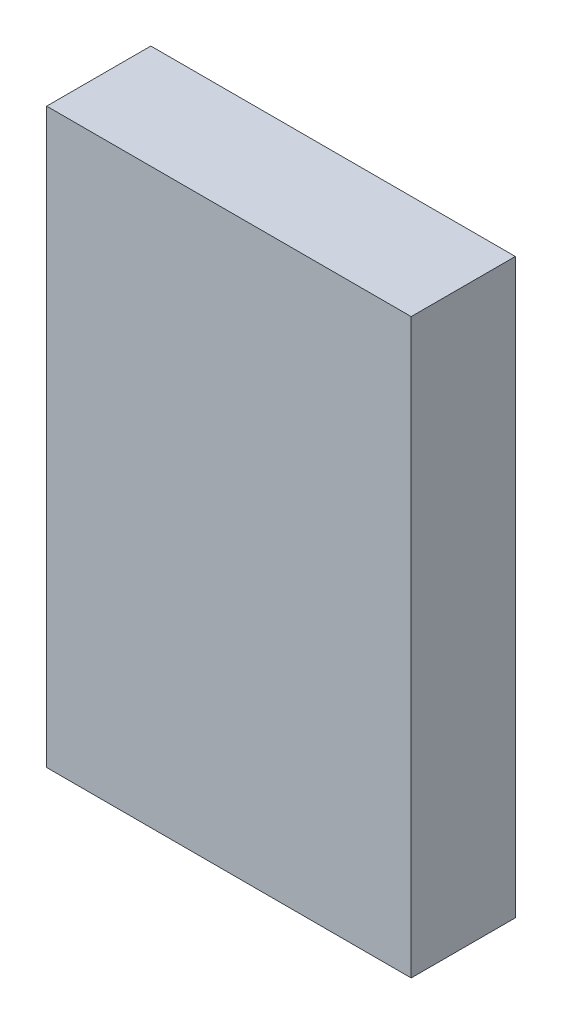
ISO-10303-21;
HEADER;
FILE_DESCRIPTION(('STEP AP214'),'2;1');
FILE_NAME('part.step','',(''),(''),'','','');
FILE_SCHEMA(('AUTOMOTIVE_DESIGN { 1 0 10303 214 1 1 1 1 }'));
ENDSEC;
DATA;
#1=APPLICATION_CONTEXT('core data for automotive mechanical design processes');
#2=APPLICATION_PROTOCOL_DEFINITION('international standard','automotive_design',2000,#1);
#3=PRODUCT_CONTEXT('',#1,'mechanical');
#4=PRODUCT('Part','Part','',(#3));
#5=PRODUCT_RELATED_PRODUCT_CATEGORY('part','',(#4));
#6=PRODUCT_DEFINITION_FORMATION('','',#4);
#7=PRODUCT_DEFINITION_CONTEXT('part definition',#1,'design');
#8=PRODUCT_DEFINITION('design','',#6,#7);
#9=PRODUCT_DEFINITION_SHAPE('','',#8);
#10=(LENGTH_UNIT() NAMED_UNIT(*) SI_UNIT(.MILLI.,.METRE.));
#11=(NAMED_UNIT(*) PLANE_ANGLE_UNIT() SI_UNIT($,.RADIAN.));
#12=(NAMED_UNIT(*) SI_UNIT($,.STERADIAN.) SOLID_ANGLE_UNIT());
#13=UNCERTAINTY_MEASURE_WITH_UNIT(LENGTH_MEASURE(1.E-05),#10,'distance_accuracy_value','');
#14=(GEOMETRIC_REPRESENTATION_CONTEXT(3) GLOBAL_UNCERTAINTY_ASSIGNED_CONTEXT((#13)) GLOBAL_UNIT_ASSIGNED_CONTEXT((#10,
#11,#12)) REPRESENTATION_CONTEXT('',''));
#15=CARTESIAN_POINT('',(0.,0.,0.));
#16=DIRECTION('',(0.,0.,1.));
#17=DIRECTION('',(1.,0.,0.));
#18=AXIS2_PLACEMENT_3D('',#15,#16,#17);
#19=CARTESIAN_POINT('',(7.,-11.,2.));
#20=DIRECTION('',(-1.,0.,0.));
#21=DIRECTION('',(0.,0.,1.));
#22=AXIS2_PLACEMENT_3D('',#19,#20,#21);
#23=PLANE('',#22);
#24=DIRECTION('',(0.,1.,0.));
#25=VECTOR('',#24,1.);
#26=CARTESIAN_POINT('',(7.,-11.,-2.));
#27=LINE('',#26,#25);
#28=CARTESIAN_POINT('',(7.,-11.,-2.));
#29=VERTEX_POINT('',#28);
#30=CARTESIAN_POINT('',(7.,11.,-2.));
#31=VERTEX_POINT('',#30);
#32=EDGE_CURVE('E104',#29,#31,#27,.T.);
#33=ORIENTED_EDGE('',*,*,#32,.T.);
#34=DIRECTION('',(0.,0.,-1.));
#35=VECTOR('',#34,1.);
#36=CARTESIAN_POINT('',(7.,11.,2.));
#37=LINE('',#36,#35);
#38=CARTESIAN_POINT('',(7.,11.,2.));
#39=VERTEX_POINT('',#38);
#40=EDGE_CURVE('E11',#39,#31,#37,.T.);
#41=ORIENTED_EDGE('',*,*,#40,.F.);
#42=DIRECTION('',(0.,1.,0.));
#43=VECTOR('',#42,1.);
#44=CARTESIAN_POINT('',(7.,-11.,2.));
#45=LINE('',#44,#43);
#46=CARTESIAN_POINT('',(7.,-11.,2.));
#47=VERTEX_POINT('',#46);
#48=EDGE_CURVE('E92',#47,#39,#45,.T.);
#49=ORIENTED_EDGE('',*,*,#48,.F.);
#50=DIRECTION('',(0.,0.,-1.));
#51=VECTOR('',#50,1.);
#52=CARTESIAN_POINT('',(7.,-11.,2.));
#53=LINE('',#52,#51);
#54=EDGE_CURVE('E100',#47,#29,#53,.T.);
#55=ORIENTED_EDGE('',*,*,#54,.T.);
#56=EDGE_LOOP('',(#33,#41,#49,#55));
#57=FACE_BOUND('',#56,.T.);
#58=ADVANCED_FACE('F41',(#57),#23,.F.);
#59=CARTESIAN_POINT('',(-7.,11.,2.));
#60=DIRECTION('',(0.,-1.,0.));
#61=DIRECTION('',(0.,0.,-1.));
#62=AXIS2_PLACEMENT_3D('',#59,#60,#61);
#63=PLANE('',#62);
#64=DIRECTION('',(-1.,0.,0.));
#65=VECTOR('',#64,1.);
#66=CARTESIAN_POINT('',(-7.,11.,-2.));
#67=LINE('',#66,#65);
#68=CARTESIAN_POINT('',(-7.,11.,-2.));
#69=VERTEX_POINT('',#68);
#70=EDGE_CURVE('E96',#31,#69,#67,.T.);
#71=ORIENTED_EDGE('',*,*,#70,.T.);
#72=DIRECTION('',(0.,0.,-1.));
#73=VECTOR('',#72,1.);
#74=CARTESIAN_POINT('',(-7.,11.,2.));
#75=LINE('',#74,#73);
#76=CARTESIAN_POINT('',(-7.,11.,2.));
#77=VERTEX_POINT('',#76);
#78=EDGE_CURVE('E49',#77,#69,#75,.T.);
#79=ORIENTED_EDGE('',*,*,#78,.F.);
#80=DIRECTION('',(-1.,0.,0.));
#81=VECTOR('',#80,1.);
#82=CARTESIAN_POINT('',(-7.,11.,2.));
#83=LINE('',#82,#81);
#84=EDGE_CURVE('E87',#39,#77,#83,.T.);
#85=ORIENTED_EDGE('',*,*,#84,.F.);
#86=ORIENTED_EDGE('',*,*,#40,.T.);
#87=EDGE_LOOP('',(#71,#79,#85,#86));
#88=FACE_BOUND('',#87,.T.);
#89=ADVANCED_FACE('F95',(#88),#63,.F.);
#90=CARTESIAN_POINT('',(-7.,-11.,2.));
#91=DIRECTION('',(1.,0.,0.));
#92=DIRECTION('',(0.,0.,-1.));
#93=AXIS2_PLACEMENT_3D('',#90,#91,#92);
#94=PLANE('',#93);
#95=DIRECTION('',(0.,-1.,0.));
#96=VECTOR('',#95,1.);
#97=CARTESIAN_POINT('',(-7.,-11.,-2.));
#98=LINE('',#97,#96);
#99=CARTESIAN_POINT('',(-7.,-11.,-2.));
#100=VERTEX_POINT('',#99);
#101=EDGE_CURVE('E74',#69,#100,#98,.T.);
#102=ORIENTED_EDGE('',*,*,#101,.T.);
#103=DIRECTION('',(0.,0.,-1.));
#104=VECTOR('',#103,1.);
#105=CARTESIAN_POINT('',(-7.,-11.,2.));
#106=LINE('',#105,#104);
#107=CARTESIAN_POINT('',(-7.,-11.,2.));
#108=VERTEX_POINT('',#107);
#109=EDGE_CURVE('E97',#108,#100,#106,.T.);
#110=ORIENTED_EDGE('',*,*,#109,.F.);
#111=DIRECTION('',(0.,-1.,0.));
#112=VECTOR('',#111,1.);
#113=CARTESIAN_POINT('',(-7.,-11.,2.));
#114=LINE('',#113,#112);
#115=EDGE_CURVE('E90',#77,#108,#114,.T.);
#116=ORIENTED_EDGE('',*,*,#115,.F.);
#117=ORIENTED_EDGE('',*,*,#78,.T.);
#118=EDGE_LOOP('',(#102,#110,#116,#117));
#119=FACE_BOUND('',#118,.T.);
#120=ADVANCED_FACE('F98',(#119),#94,.F.);
#121=CARTESIAN_POINT('',(-7.,-11.,2.));
#122=DIRECTION('',(0.,1.,0.));
#123=DIRECTION('',(0.,0.,1.));
#124=AXIS2_PLACEMENT_3D('',#121,#122,#123);
#125=PLANE('',#124);
#126=DIRECTION('',(1.,0.,0.));
#127=VECTOR('',#126,1.);
#128=CARTESIAN_POINT('',(-7.,-11.,-2.));
#129=LINE('',#128,#127);
#130=EDGE_CURVE('E80',#100,#29,#129,.T.);
#131=ORIENTED_EDGE('',*,*,#130,.T.);
#132=ORIENTED_EDGE('',*,*,#54,.F.);
#133=DIRECTION('',(1.,0.,0.));
#134=VECTOR('',#133,1.);
#135=CARTESIAN_POINT('',(-7.,-11.,2.));
#136=LINE('',#135,#134);
#137=EDGE_CURVE('E57',#108,#47,#136,.T.);
#138=ORIENTED_EDGE('',*,*,#137,.F.);
#139=ORIENTED_EDGE('',*,*,#109,.T.);
#140=EDGE_LOOP('',(#131,#132,#138,#139));
#141=FACE_BOUND('',#140,.T.);
#142=ADVANCED_FACE('F111',(#141),#125,.F.);
#143=CARTESIAN_POINT('',(0.,0.,2.));
#144=DIRECTION('',(0.,0.,-1.));
#145=DIRECTION('',(-1.,0.,0.));
#146=AXIS2_PLACEMENT_3D('',#143,#144,#145);
#147=PLANE('',#146);
#148=ORIENTED_EDGE('',*,*,#48,.T.);
#149=ORIENTED_EDGE('',*,*,#84,.T.);
#150=ORIENTED_EDGE('',*,*,#115,.T.);
#151=ORIENTED_EDGE('',*,*,#137,.T.);
#152=EDGE_LOOP('',(#148,#149,#150,#151));
#153=FACE_BOUND('',#152,.T.);
#154=ADVANCED_FACE('F88',(#153),#147,.F.);
#155=CARTESIAN_POINT('',(0.,0.,-2.));
#156=DIRECTION('',(0.,0.,-1.));
#157=DIRECTION('',(-1.,0.,0.));
#158=AXIS2_PLACEMENT_3D('',#155,#156,#157);
#159=PLANE('',#158);
#160=ORIENTED_EDGE('',*,*,#32,.F.);
#161=ORIENTED_EDGE('',*,*,#130,.F.);
#162=ORIENTED_EDGE('',*,*,#101,.F.);
#163=ORIENTED_EDGE('',*,*,#70,.F.);
#164=EDGE_LOOP('',(#160,#161,#162,#163));
#165=FACE_BOUND('',#164,.T.);
#166=ADVANCED_FACE('F114',(#165),#159,.T.);
#167=CLOSED_SHELL('',(#58,#89,#120,#142,#154,#166));
#168=MANIFOLD_SOLID_BREP('B2',#167);
#169=ADVANCED_BREP_SHAPE_REPRESENTATION('',(#18,#168),#14);
#170=SHAPE_DEFINITION_REPRESENTATION(#9,#169);
ENDSEC;
END-ISO-10303-21;
